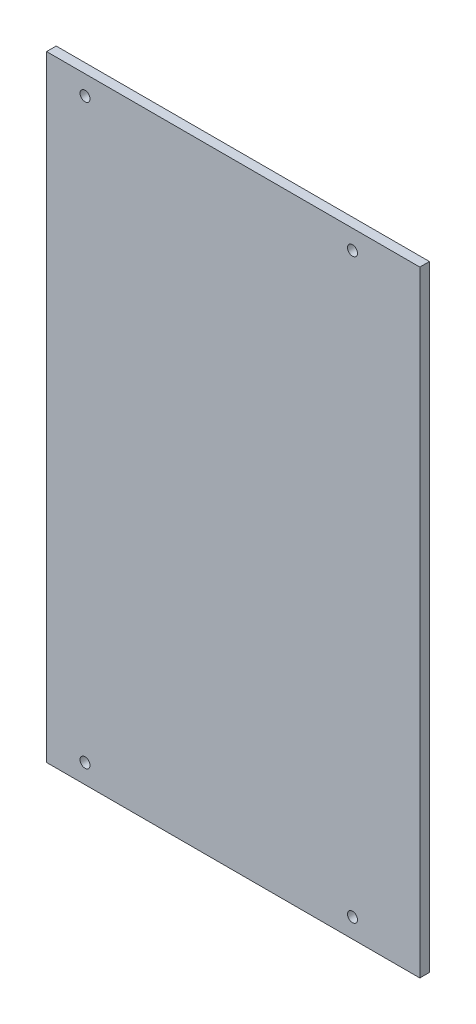
ISO-10303-21;
HEADER;
FILE_DESCRIPTION(('STEP AP214'),'2;1');
FILE_NAME('part.step','',(''),(''),'','','');
FILE_SCHEMA(('AUTOMOTIVE_DESIGN { 1 0 10303 214 1 1 1 1 }'));
ENDSEC;
DATA;
#1=APPLICATION_CONTEXT('core data for automotive mechanical design processes');
#2=APPLICATION_PROTOCOL_DEFINITION('international standard','automotive_design',2000,#1);
#3=PRODUCT_CONTEXT('',#1,'mechanical');
#4=PRODUCT('Part','Part','',(#3));
#5=PRODUCT_RELATED_PRODUCT_CATEGORY('part','',(#4));
#6=PRODUCT_DEFINITION_FORMATION('','',#4);
#7=PRODUCT_DEFINITION_CONTEXT('part definition',#1,'design');
#8=PRODUCT_DEFINITION('design','',#6,#7);
#9=PRODUCT_DEFINITION_SHAPE('','',#8);
#10=(LENGTH_UNIT() NAMED_UNIT(*) SI_UNIT(.MILLI.,.METRE.));
#11=(NAMED_UNIT(*) PLANE_ANGLE_UNIT() SI_UNIT($,.RADIAN.));
#12=(NAMED_UNIT(*) SI_UNIT($,.STERADIAN.) SOLID_ANGLE_UNIT());
#13=UNCERTAINTY_MEASURE_WITH_UNIT(LENGTH_MEASURE(1.E-05),#10,'distance_accuracy_value','');
#14=(GEOMETRIC_REPRESENTATION_CONTEXT(3) GLOBAL_UNCERTAINTY_ASSIGNED_CONTEXT((#13)) GLOBAL_UNIT_ASSIGNED_CONTEXT((#10,
#11,#12)) REPRESENTATION_CONTEXT('',''));
#15=CARTESIAN_POINT('',(0.,0.,0.));
#16=DIRECTION('',(0.,0.,1.));
#17=DIRECTION('',(1.,0.,0.));
#18=AXIS2_PLACEMENT_3D('',#15,#16,#17);
#19=CARTESIAN_POINT('',(0.,0.,5.));
#20=DIRECTION('',(0.,0.,-1.));
#21=DIRECTION('',(-1.,0.,0.));
#22=AXIS2_PLACEMENT_3D('',#19,#20,#21);
#23=PLANE('',#22);
#24=DIRECTION('',(1.,0.,0.));
#25=VECTOR('',#24,1.);
#26=CARTESIAN_POINT('',(194.,0.,5.));
#27=LINE('',#26,#25);
#28=CARTESIAN_POINT('',(0.,0.,5.));
#29=VERTEX_POINT('',#28);
#30=CARTESIAN_POINT('',(194.,0.,5.));
#31=VERTEX_POINT('',#30);
#32=EDGE_CURVE('E87',#29,#31,#27,.T.);
#33=ORIENTED_EDGE('',*,*,#32,.T.);
#34=DIRECTION('',(0.,1.,0.));
#35=VECTOR('',#34,1.);
#36=CARTESIAN_POINT('',(194.,320.,5.));
#37=LINE('',#36,#35);
#38=CARTESIAN_POINT('',(194.,320.,5.));
#39=VERTEX_POINT('',#38);
#40=EDGE_CURVE('E82',#31,#39,#37,.T.);
#41=ORIENTED_EDGE('',*,*,#40,.T.);
#42=DIRECTION('',(-1.,0.,0.));
#43=VECTOR('',#42,1.);
#44=CARTESIAN_POINT('',(0.,320.,5.));
#45=LINE('',#44,#43);
#46=CARTESIAN_POINT('',(0.,320.,5.));
#47=VERTEX_POINT('',#46);
#48=EDGE_CURVE('E85',#39,#47,#45,.T.);
#49=ORIENTED_EDGE('',*,*,#48,.T.);
#50=DIRECTION('',(0.,-1.,0.));
#51=VECTOR('',#50,1.);
#52=CARTESIAN_POINT('',(0.,0.,5.));
#53=LINE('',#52,#51);
#54=EDGE_CURVE('E52',#47,#29,#53,.T.);
#55=ORIENTED_EDGE('',*,*,#54,.T.);
#56=EDGE_LOOP('',(#33,#41,#49,#55));
#57=FACE_BOUND('',#56,.T.);
#58=CARTESIAN_POINT('',(20.,310.,5.));
#59=DIRECTION('',(0.,0.,1.));
#60=DIRECTION('',(1.,0.,0.));
#61=AXIS2_PLACEMENT_3D('',#58,#59,#60);
#62=CIRCLE('',#61,2.6);
#63=CARTESIAN_POINT('',(22.6,310.,5.));
#64=VERTEX_POINT('',#63);
#65=EDGE_CURVE('E102',#64,#64,#62,.T.);
#66=ORIENTED_EDGE('',*,*,#65,.F.);
#67=EDGE_LOOP('',(#66));
#68=FACE_BOUND('',#67,.T.);
#69=CARTESIAN_POINT('',(159.,310.,5.));
#70=DIRECTION('',(0.,0.,1.));
#71=DIRECTION('',(1.,0.,0.));
#72=AXIS2_PLACEMENT_3D('',#69,#70,#71);
#73=CIRCLE('',#72,2.60000000000001);
#74=CARTESIAN_POINT('',(161.6,310.,5.));
#75=VERTEX_POINT('',#74);
#76=EDGE_CURVE('E117',#75,#75,#73,.T.);
#77=ORIENTED_EDGE('',*,*,#76,.F.);
#78=EDGE_LOOP('',(#77));
#79=FACE_BOUND('',#78,.T.);
#80=CARTESIAN_POINT('',(159.000000000003,10.,5.));
#81=DIRECTION('',(0.,0.,1.));
#82=DIRECTION('',(1.,0.,0.));
#83=AXIS2_PLACEMENT_3D('',#80,#81,#82);
#84=CIRCLE('',#83,2.60000000000002);
#85=CARTESIAN_POINT('',(161.600000000003,10.,5.));
#86=VERTEX_POINT('',#85);
#87=EDGE_CURVE('E123',#86,#86,#84,.T.);
#88=ORIENTED_EDGE('',*,*,#87,.F.);
#89=EDGE_LOOP('',(#88));
#90=FACE_BOUND('',#89,.T.);
#91=CARTESIAN_POINT('',(20.0000000000031,10.,5.));
#92=DIRECTION('',(0.,0.,1.));
#93=DIRECTION('',(1.,0.,0.));
#94=AXIS2_PLACEMENT_3D('',#91,#92,#93);
#95=CIRCLE('',#94,2.6);
#96=CARTESIAN_POINT('',(22.6000000000031,10.,5.));
#97=VERTEX_POINT('',#96);
#98=EDGE_CURVE('E129',#97,#97,#95,.T.);
#99=ORIENTED_EDGE('',*,*,#98,.F.);
#100=EDGE_LOOP('',(#99));
#101=FACE_BOUND('',#100,.T.);
#102=ADVANCED_FACE('F35',(#57,#68,#79,#90,#101),#23,.F.);
#103=CARTESIAN_POINT('',(0.,0.,0.));
#104=DIRECTION('',(0.,0.,-1.));
#105=DIRECTION('',(-1.,0.,0.));
#106=AXIS2_PLACEMENT_3D('',#103,#104,#105);
#107=PLANE('',#106);
#108=CARTESIAN_POINT('',(159.000000000003,10.,0.));
#109=DIRECTION('',(0.,0.,1.));
#110=DIRECTION('',(1.,0.,0.));
#111=AXIS2_PLACEMENT_3D('',#108,#109,#110);
#112=CIRCLE('',#111,2.60000000000002);
#113=CARTESIAN_POINT('',(161.600000000003,10.,0.));
#114=VERTEX_POINT('',#113);
#115=EDGE_CURVE('E126',#114,#114,#112,.T.);
#116=ORIENTED_EDGE('',*,*,#115,.T.);
#117=EDGE_LOOP('',(#116));
#118=FACE_BOUND('',#117,.T.);
#119=CARTESIAN_POINT('',(20.,310.,0.));
#120=DIRECTION('',(0.,0.,1.));
#121=DIRECTION('',(1.,0.,0.));
#122=AXIS2_PLACEMENT_3D('',#119,#120,#121);
#123=CIRCLE('',#122,2.6);
#124=CARTESIAN_POINT('',(22.6,310.,0.));
#125=VERTEX_POINT('',#124);
#126=EDGE_CURVE('E114',#125,#125,#123,.T.);
#127=ORIENTED_EDGE('',*,*,#126,.T.);
#128=EDGE_LOOP('',(#127));
#129=FACE_BOUND('',#128,.T.);
#130=DIRECTION('',(1.,0.,0.));
#131=VECTOR('',#130,1.);
#132=CARTESIAN_POINT('',(194.,0.,0.));
#133=LINE('',#132,#131);
#134=CARTESIAN_POINT('',(0.,0.,0.));
#135=VERTEX_POINT('',#134);
#136=CARTESIAN_POINT('',(194.,0.,0.));
#137=VERTEX_POINT('',#136);
#138=EDGE_CURVE('E99',#135,#137,#133,.T.);
#139=ORIENTED_EDGE('',*,*,#138,.F.);
#140=DIRECTION('',(0.,-1.,0.));
#141=VECTOR('',#140,1.);
#142=CARTESIAN_POINT('',(0.,0.,0.));
#143=LINE('',#142,#141);
#144=CARTESIAN_POINT('',(0.,320.,0.));
#145=VERTEX_POINT('',#144);
#146=EDGE_CURVE('E75',#145,#135,#143,.T.);
#147=ORIENTED_EDGE('',*,*,#146,.F.);
#148=DIRECTION('',(-1.,0.,0.));
#149=VECTOR('',#148,1.);
#150=CARTESIAN_POINT('',(0.,320.,0.));
#151=LINE('',#150,#149);
#152=CARTESIAN_POINT('',(194.,320.,0.));
#153=VERTEX_POINT('',#152);
#154=EDGE_CURVE('E69',#153,#145,#151,.T.);
#155=ORIENTED_EDGE('',*,*,#154,.F.);
#156=DIRECTION('',(0.,1.,0.));
#157=VECTOR('',#156,1.);
#158=CARTESIAN_POINT('',(194.,320.,0.));
#159=LINE('',#158,#157);
#160=EDGE_CURVE('E91',#137,#153,#159,.T.);
#161=ORIENTED_EDGE('',*,*,#160,.F.);
#162=EDGE_LOOP('',(#139,#147,#155,#161));
#163=FACE_BOUND('',#162,.T.);
#164=CARTESIAN_POINT('',(159.,310.,0.));
#165=DIRECTION('',(0.,0.,1.));
#166=DIRECTION('',(1.,0.,0.));
#167=AXIS2_PLACEMENT_3D('',#164,#165,#166);
#168=CIRCLE('',#167,2.60000000000001);
#169=CARTESIAN_POINT('',(161.6,310.,0.));
#170=VERTEX_POINT('',#169);
#171=EDGE_CURVE('E120',#170,#170,#168,.T.);
#172=ORIENTED_EDGE('',*,*,#171,.T.);
#173=EDGE_LOOP('',(#172));
#174=FACE_BOUND('',#173,.T.);
#175=CARTESIAN_POINT('',(20.0000000000031,10.,0.));
#176=DIRECTION('',(0.,0.,1.));
#177=DIRECTION('',(1.,0.,0.));
#178=AXIS2_PLACEMENT_3D('',#175,#176,#177);
#179=CIRCLE('',#178,2.6);
#180=CARTESIAN_POINT('',(22.6000000000031,10.,0.));
#181=VERTEX_POINT('',#180);
#182=EDGE_CURVE('E132',#181,#181,#179,.T.);
#183=ORIENTED_EDGE('',*,*,#182,.T.);
#184=EDGE_LOOP('',(#183));
#185=FACE_BOUND('',#184,.T.);
#186=ADVANCED_FACE('F110',(#118,#129,#163,#174,#185),#107,.T.);
#187=CARTESIAN_POINT('',(194.,0.,5.));
#188=DIRECTION('',(0.,1.,0.));
#189=DIRECTION('',(-1.,0.,0.));
#190=AXIS2_PLACEMENT_3D('',#187,#188,#189);
#191=PLANE('',#190);
#192=ORIENTED_EDGE('',*,*,#138,.T.);
#193=DIRECTION('',(0.,0.,-1.));
#194=VECTOR('',#193,1.);
#195=CARTESIAN_POINT('',(194.,0.,5.));
#196=LINE('',#195,#194);
#197=EDGE_CURVE('E11',#31,#137,#196,.T.);
#198=ORIENTED_EDGE('',*,*,#197,.F.);
#199=ORIENTED_EDGE('',*,*,#32,.F.);
#200=DIRECTION('',(0.,0.,-1.));
#201=VECTOR('',#200,1.);
#202=CARTESIAN_POINT('',(0.,0.,5.));
#203=LINE('',#202,#201);
#204=EDGE_CURVE('E95',#29,#135,#203,.T.);
#205=ORIENTED_EDGE('',*,*,#204,.T.);
#206=EDGE_LOOP('',(#192,#198,#199,#205));
#207=FACE_BOUND('',#206,.T.);
#208=ADVANCED_FACE('F37',(#207),#191,.F.);
#209=CARTESIAN_POINT('',(194.,320.,5.));
#210=DIRECTION('',(-1.,0.,0.));
#211=DIRECTION('',(0.,0.,1.));
#212=AXIS2_PLACEMENT_3D('',#209,#210,#211);
#213=PLANE('',#212);
#214=ORIENTED_EDGE('',*,*,#160,.T.);
#215=DIRECTION('',(0.,0.,-1.));
#216=VECTOR('',#215,1.);
#217=CARTESIAN_POINT('',(194.,320.,5.));
#218=LINE('',#217,#216);
#219=EDGE_CURVE('E44',#39,#153,#218,.T.);
#220=ORIENTED_EDGE('',*,*,#219,.F.);
#221=ORIENTED_EDGE('',*,*,#40,.F.);
#222=ORIENTED_EDGE('',*,*,#197,.T.);
#223=EDGE_LOOP('',(#214,#220,#221,#222));
#224=FACE_BOUND('',#223,.T.);
#225=ADVANCED_FACE('F90',(#224),#213,.F.);
#226=CARTESIAN_POINT('',(0.,320.,5.));
#227=DIRECTION('',(0.,-1.,0.));
#228=DIRECTION('',(0.,0.,-1.));
#229=AXIS2_PLACEMENT_3D('',#226,#227,#228);
#230=PLANE('',#229);
#231=ORIENTED_EDGE('',*,*,#154,.T.);
#232=DIRECTION('',(0.,0.,-1.));
#233=VECTOR('',#232,1.);
#234=CARTESIAN_POINT('',(0.,320.,5.));
#235=LINE('',#234,#233);
#236=EDGE_CURVE('E92',#47,#145,#235,.T.);
#237=ORIENTED_EDGE('',*,*,#236,.F.);
#238=ORIENTED_EDGE('',*,*,#48,.F.);
#239=ORIENTED_EDGE('',*,*,#219,.T.);
#240=EDGE_LOOP('',(#231,#237,#238,#239));
#241=FACE_BOUND('',#240,.T.);
#242=ADVANCED_FACE('F93',(#241),#230,.F.);
#243=CARTESIAN_POINT('',(0.,0.,5.));
#244=DIRECTION('',(1.,0.,0.));
#245=DIRECTION('',(0.,0.,-1.));
#246=AXIS2_PLACEMENT_3D('',#243,#244,#245);
#247=PLANE('',#246);
#248=ORIENTED_EDGE('',*,*,#146,.T.);
#249=ORIENTED_EDGE('',*,*,#204,.F.);
#250=ORIENTED_EDGE('',*,*,#54,.F.);
#251=ORIENTED_EDGE('',*,*,#236,.T.);
#252=EDGE_LOOP('',(#248,#249,#250,#251));
#253=FACE_BOUND('',#252,.T.);
#254=ADVANCED_FACE('F107',(#253),#247,.F.);
#255=CARTESIAN_POINT('',(20.,310.,5.));
#256=DIRECTION('',(0.,0.,-1.));
#257=DIRECTION('',(-1.,0.,0.));
#258=AXIS2_PLACEMENT_3D('',#255,#256,#257);
#259=CYLINDRICAL_SURFACE('',#258,2.6);
#260=ORIENTED_EDGE('',*,*,#65,.T.);
#261=EDGE_LOOP('',(#260));
#262=FACE_BOUND('',#261,.T.);
#263=ORIENTED_EDGE('',*,*,#126,.F.);
#264=EDGE_LOOP('',(#263));
#265=FACE_BOUND('',#264,.T.);
#266=ADVANCED_FACE('F149',(#262,#265),#259,.F.);
#267=CARTESIAN_POINT('',(159.,310.,5.));
#268=DIRECTION('',(0.,0.,-1.));
#269=DIRECTION('',(-1.,0.,0.));
#270=AXIS2_PLACEMENT_3D('',#267,#268,#269);
#271=CYLINDRICAL_SURFACE('',#270,2.60000000000001);
#272=ORIENTED_EDGE('',*,*,#76,.T.);
#273=EDGE_LOOP('',(#272));
#274=FACE_BOUND('',#273,.T.);
#275=ORIENTED_EDGE('',*,*,#171,.F.);
#276=EDGE_LOOP('',(#275));
#277=FACE_BOUND('',#276,.T.);
#278=ADVANCED_FACE('F195',(#274,#277),#271,.F.);
#279=CARTESIAN_POINT('',(159.000000000003,10.,5.));
#280=DIRECTION('',(0.,0.,-1.));
#281=DIRECTION('',(-1.,0.,0.));
#282=AXIS2_PLACEMENT_3D('',#279,#280,#281);
#283=CYLINDRICAL_SURFACE('',#282,2.60000000000002);
#284=ORIENTED_EDGE('',*,*,#87,.T.);
#285=EDGE_LOOP('',(#284));
#286=FACE_BOUND('',#285,.T.);
#287=ORIENTED_EDGE('',*,*,#115,.F.);
#288=EDGE_LOOP('',(#287));
#289=FACE_BOUND('',#288,.T.);
#290=ADVANCED_FACE('F203',(#286,#289),#283,.F.);
#291=CARTESIAN_POINT('',(20.0000000000031,10.,5.));
#292=DIRECTION('',(0.,0.,-1.));
#293=DIRECTION('',(-1.,0.,0.));
#294=AXIS2_PLACEMENT_3D('',#291,#292,#293);
#295=CYLINDRICAL_SURFACE('',#294,2.6);
#296=ORIENTED_EDGE('',*,*,#98,.T.);
#297=EDGE_LOOP('',(#296));
#298=FACE_BOUND('',#297,.T.);
#299=ORIENTED_EDGE('',*,*,#182,.F.);
#300=EDGE_LOOP('',(#299));
#301=FACE_BOUND('',#300,.T.);
#302=ADVANCED_FACE('F138',(#298,#301),#295,.F.);
#303=CLOSED_SHELL('',(#102,#186,#208,#225,#242,#254,#266,#278,#290,#302));
#304=MANIFOLD_SOLID_BREP('B2',#303);
#305=ADVANCED_BREP_SHAPE_REPRESENTATION('',(#18,#304),#14);
#306=SHAPE_DEFINITION_REPRESENTATION(#9,#305);
ENDSEC;
END-ISO-10303-21;
